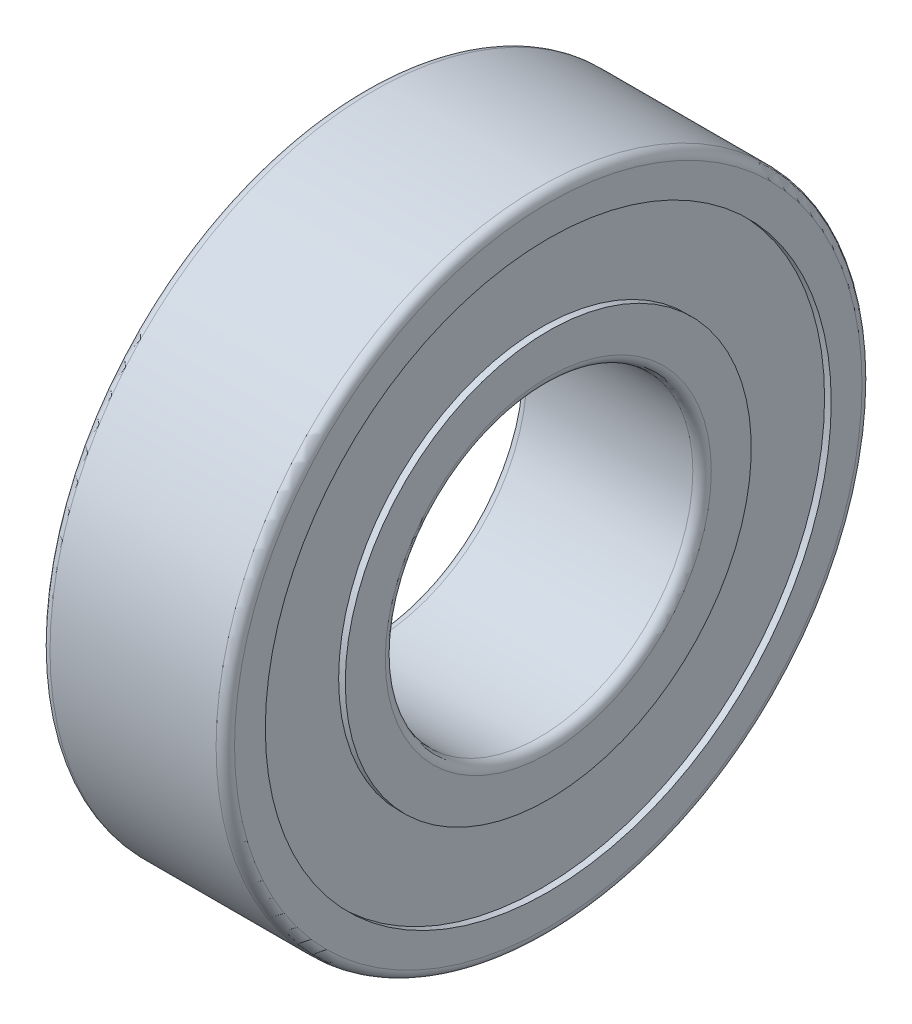
ISO-10303-21;
HEADER;
FILE_DESCRIPTION(('STEP AP214'),'2;1');
FILE_NAME('part.step','',(''),(''),'','','');
FILE_SCHEMA(('AUTOMOTIVE_DESIGN { 1 0 10303 214 1 1 1 1 }'));
ENDSEC;
DATA;
#1=APPLICATION_CONTEXT('core data for automotive mechanical design processes');
#2=APPLICATION_PROTOCOL_DEFINITION('international standard','automotive_design',2000,#1);
#3=PRODUCT_CONTEXT('',#1,'mechanical');
#4=PRODUCT('Part','Part','',(#3));
#5=PRODUCT_RELATED_PRODUCT_CATEGORY('part','',(#4));
#6=PRODUCT_DEFINITION_FORMATION('','',#4);
#7=PRODUCT_DEFINITION_CONTEXT('part definition',#1,'design');
#8=PRODUCT_DEFINITION('design','',#6,#7);
#9=PRODUCT_DEFINITION_SHAPE('','',#8);
#10=(LENGTH_UNIT() NAMED_UNIT(*) SI_UNIT(.MILLI.,.METRE.));
#11=(NAMED_UNIT(*) PLANE_ANGLE_UNIT() SI_UNIT($,.RADIAN.));
#12=(NAMED_UNIT(*) SI_UNIT($,.STERADIAN.) SOLID_ANGLE_UNIT());
#13=UNCERTAINTY_MEASURE_WITH_UNIT(LENGTH_MEASURE(1.E-05),#10,'distance_accuracy_value','');
#14=(GEOMETRIC_REPRESENTATION_CONTEXT(3) GLOBAL_UNCERTAINTY_ASSIGNED_CONTEXT((#13)) GLOBAL_UNIT_ASSIGNED_CONTEXT((#10,
#11,#12)) REPRESENTATION_CONTEXT('',''));
#15=CARTESIAN_POINT('',(0.,0.,0.));
#16=DIRECTION('',(0.,0.,1.));
#17=DIRECTION('',(1.,0.,0.));
#18=AXIS2_PLACEMENT_3D('',#15,#16,#17);
#19=CARTESIAN_POINT('',(12.,0.,0.));
#20=DIRECTION('',(-1.,0.,0.));
#21=DIRECTION('',(0.,0.,1.));
#22=AXIS2_PLACEMENT_3D('',#19,#20,#21);
#23=CYLINDRICAL_SURFACE('',#22,10.);
#24=CARTESIAN_POINT('',(0.600000000000005,0.,0.));
#25=DIRECTION('',(1.,0.,0.));
#26=DIRECTION('',(0.,0.,-1.));
#27=AXIS2_PLACEMENT_3D('',#24,#25,#26);
#28=CIRCLE('',#27,10.);
#29=CARTESIAN_POINT('',(0.600000000000005,0.,-10.));
#30=VERTEX_POINT('',#29);
#31=EDGE_CURVE('E272',#30,#30,#28,.T.);
#32=ORIENTED_EDGE('',*,*,#31,.F.);
#33=EDGE_LOOP('',(#32));
#34=FACE_BOUND('',#33,.T.);
#35=CARTESIAN_POINT('',(11.4,0.,0.));
#36=DIRECTION('',(1.,0.,0.));
#37=DIRECTION('',(0.,0.,-1.));
#38=AXIS2_PLACEMENT_3D('',#35,#36,#37);
#39=CIRCLE('',#38,9.99999999999999);
#40=CARTESIAN_POINT('',(11.4,0.,-9.99999999999999));
#41=VERTEX_POINT('',#40);
#42=EDGE_CURVE('E63',#41,#41,#39,.F.);
#43=ORIENTED_EDGE('',*,*,#42,.F.);
#44=EDGE_LOOP('',(#43));
#45=FACE_BOUND('',#44,.T.);
#46=ADVANCED_FACE('F17',(#34,#45),#23,.F.);
#47=CARTESIAN_POINT('',(0.600000000000004,0.,0.));
#48=DIRECTION('',(1.,0.,0.));
#49=DIRECTION('',(0.,0.,-1.));
#50=AXIS2_PLACEMENT_3D('',#47,#48,#49);
#51=TOROIDAL_SURFACE('',#50,10.6,0.600000000000004);
#52=CARTESIAN_POINT('',(0.,0.,0.));
#53=DIRECTION('',(-1.,0.,0.));
#54=DIRECTION('',(0.,0.,-1.));
#55=AXIS2_PLACEMENT_3D('',#52,#53,#54);
#56=CIRCLE('',#55,10.6);
#57=CARTESIAN_POINT('',(0.,0.,10.6));
#58=VERTEX_POINT('',#57);
#59=CARTESIAN_POINT('',(0.,0.,-10.6));
#60=VERTEX_POINT('',#59);
#61=EDGE_CURVE('E57',#58,#60,#56,.F.);
#62=ORIENTED_EDGE('',*,*,#61,.F.);
#63=CARTESIAN_POINT('',(0.,0.,0.));
#64=DIRECTION('',(-1.,0.,0.));
#65=DIRECTION('',(0.,0.,1.));
#66=AXIS2_PLACEMENT_3D('',#63,#64,#65);
#67=CIRCLE('',#66,10.6);
#68=EDGE_CURVE('E54',#60,#58,#67,.F.);
#69=ORIENTED_EDGE('',*,*,#68,.F.);
#70=EDGE_LOOP('',(#62,#69));
#71=FACE_BOUND('',#70,.T.);
#72=ORIENTED_EDGE('',*,*,#31,.T.);
#73=EDGE_LOOP('',(#72));
#74=FACE_BOUND('',#73,.T.);
#75=ADVANCED_FACE('F58',(#71,#74),#51,.T.);
#76=CARTESIAN_POINT('',(11.4,0.,0.));
#77=DIRECTION('',(1.,0.,0.));
#78=DIRECTION('',(0.,0.,-1.));
#79=AXIS2_PLACEMENT_3D('',#76,#77,#78);
#80=TOROIDAL_SURFACE('',#79,10.6,0.600000000000005);
#81=ORIENTED_EDGE('',*,*,#42,.T.);
#82=EDGE_LOOP('',(#81));
#83=FACE_BOUND('',#82,.T.);
#84=CARTESIAN_POINT('',(12.,0.,0.));
#85=DIRECTION('',(1.,0.,0.));
#86=DIRECTION('',(0.,0.,1.));
#87=AXIS2_PLACEMENT_3D('',#84,#85,#86);
#88=CIRCLE('',#87,10.6);
#89=CARTESIAN_POINT('',(12.,0.,-10.6));
#90=VERTEX_POINT('',#89);
#91=CARTESIAN_POINT('',(12.,0.,10.6));
#92=VERTEX_POINT('',#91);
#93=EDGE_CURVE('E226',#90,#92,#88,.F.);
#94=ORIENTED_EDGE('',*,*,#93,.F.);
#95=CARTESIAN_POINT('',(12.,0.,0.));
#96=DIRECTION('',(1.,0.,0.));
#97=DIRECTION('',(0.,0.,-1.));
#98=AXIS2_PLACEMENT_3D('',#95,#96,#97);
#99=CIRCLE('',#98,10.6);
#100=EDGE_CURVE('E69',#92,#90,#99,.F.);
#101=ORIENTED_EDGE('',*,*,#100,.F.);
#102=EDGE_LOOP('',(#94,#101));
#103=FACE_BOUND('',#102,.T.);
#104=ADVANCED_FACE('F90',(#83,#103),#80,.T.);
#105=CARTESIAN_POINT('',(0.,13.2,0.));
#106=DIRECTION('',(-1.,0.,0.));
#107=DIRECTION('',(0.,0.,1.));
#108=AXIS2_PLACEMENT_3D('',#105,#106,#107);
#109=PLANE('',#108);
#110=ORIENTED_EDGE('',*,*,#61,.T.);
#111=ORIENTED_EDGE('',*,*,#68,.T.);
#112=EDGE_LOOP('',(#110,#111));
#113=FACE_BOUND('',#112,.T.);
#114=CARTESIAN_POINT('',(0.,0.,0.));
#115=DIRECTION('',(-1.,0.,0.));
#116=DIRECTION('',(0.,0.,1.));
#117=AXIS2_PLACEMENT_3D('',#114,#115,#116);
#118=CIRCLE('',#117,13.2);
#119=CARTESIAN_POINT('',(0.,0.,13.2));
#120=VERTEX_POINT('',#119);
#121=EDGE_CURVE('E236',#120,#120,#118,.F.);
#122=ORIENTED_EDGE('',*,*,#121,.F.);
#123=EDGE_LOOP('',(#122));
#124=FACE_BOUND('',#123,.T.);
#125=ADVANCED_FACE('F66',(#113,#124),#109,.T.);
#126=CARTESIAN_POINT('',(12.,10.6,0.));
#127=DIRECTION('',(1.,0.,0.));
#128=DIRECTION('',(0.,0.,-1.));
#129=AXIS2_PLACEMENT_3D('',#126,#127,#128);
#130=PLANE('',#129);
#131=ORIENTED_EDGE('',*,*,#100,.T.);
#132=ORIENTED_EDGE('',*,*,#93,.T.);
#133=EDGE_LOOP('',(#131,#132));
#134=FACE_BOUND('',#133,.T.);
#135=CARTESIAN_POINT('',(12.,0.,0.));
#136=DIRECTION('',(-1.,0.,0.));
#137=DIRECTION('',(0.,0.,1.));
#138=AXIS2_PLACEMENT_3D('',#135,#136,#137);
#139=CIRCLE('',#138,13.2);
#140=CARTESIAN_POINT('',(12.,0.,13.2));
#141=VERTEX_POINT('',#140);
#142=EDGE_CURVE('E242',#141,#141,#139,.T.);
#143=ORIENTED_EDGE('',*,*,#142,.F.);
#144=EDGE_LOOP('',(#143));
#145=FACE_BOUND('',#144,.T.);
#146=ADVANCED_FACE('F89',(#134,#145),#130,.T.);
#147=CARTESIAN_POINT('',(12.,0.,0.));
#148=DIRECTION('',(-1.,0.,0.));
#149=DIRECTION('',(0.,0.,1.));
#150=AXIS2_PLACEMENT_3D('',#147,#148,#149);
#151=CYLINDRICAL_SURFACE('',#150,13.2);
#152=ORIENTED_EDGE('',*,*,#121,.T.);
#153=EDGE_LOOP('',(#152));
#154=FACE_BOUND('',#153,.T.);
#155=CARTESIAN_POINT('',(0.432999999999996,0.,0.));
#156=DIRECTION('',(-1.,0.,0.));
#157=DIRECTION('',(0.,0.,1.));
#158=AXIS2_PLACEMENT_3D('',#155,#156,#157);
#159=CIRCLE('',#158,13.2);
#160=CARTESIAN_POINT('',(0.432999999999996,0.,13.2));
#161=VERTEX_POINT('',#160);
#162=EDGE_CURVE('E257',#161,#161,#159,.F.);
#163=ORIENTED_EDGE('',*,*,#162,.F.);
#164=EDGE_LOOP('',(#163));
#165=FACE_BOUND('',#164,.T.);
#166=ADVANCED_FACE('F294',(#154,#165),#151,.T.);
#167=CARTESIAN_POINT('',(12.,0.,0.));
#168=DIRECTION('',(-1.,0.,0.));
#169=DIRECTION('',(0.,0.,1.));
#170=AXIS2_PLACEMENT_3D('',#167,#168,#169);
#171=CYLINDRICAL_SURFACE('',#170,13.2);
#172=CARTESIAN_POINT('',(11.567,0.,0.));
#173=DIRECTION('',(-1.,0.,0.));
#174=DIRECTION('',(0.,0.,1.));
#175=AXIS2_PLACEMENT_3D('',#172,#173,#174);
#176=CIRCLE('',#175,13.2);
#177=CARTESIAN_POINT('',(11.567,0.,13.2));
#178=VERTEX_POINT('',#177);
#179=EDGE_CURVE('E253',#178,#178,#176,.T.);
#180=ORIENTED_EDGE('',*,*,#179,.F.);
#181=EDGE_LOOP('',(#180));
#182=FACE_BOUND('',#181,.T.);
#183=ORIENTED_EDGE('',*,*,#142,.T.);
#184=EDGE_LOOP('',(#183));
#185=FACE_BOUND('',#184,.T.);
#186=ADVANCED_FACE('F292',(#182,#185),#171,.T.);
#187=CARTESIAN_POINT('',(0.433,18.4,0.));
#188=DIRECTION('',(-1.,0.,0.));
#189=DIRECTION('',(0.,0.,1.));
#190=AXIS2_PLACEMENT_3D('',#187,#188,#189);
#191=PLANE('',#190);
#192=ORIENTED_EDGE('',*,*,#162,.T.);
#193=EDGE_LOOP('',(#192));
#194=FACE_BOUND('',#193,.T.);
#195=CARTESIAN_POINT('',(0.432999999999996,0.,0.));
#196=DIRECTION('',(-1.,0.,0.));
#197=DIRECTION('',(0.,0.,1.));
#198=AXIS2_PLACEMENT_3D('',#195,#196,#197);
#199=CIRCLE('',#198,18.4);
#200=CARTESIAN_POINT('',(0.432999999999996,0.,18.4));
#201=VERTEX_POINT('',#200);
#202=EDGE_CURVE('E256',#201,#201,#199,.T.);
#203=ORIENTED_EDGE('',*,*,#202,.T.);
#204=EDGE_LOOP('',(#203));
#205=FACE_BOUND('',#204,.T.);
#206=ADVANCED_FACE('F340',(#194,#205),#191,.T.);
#207=CARTESIAN_POINT('',(11.567,13.2,0.));
#208=DIRECTION('',(1.,0.,0.));
#209=DIRECTION('',(0.,0.,-1.));
#210=AXIS2_PLACEMENT_3D('',#207,#208,#209);
#211=PLANE('',#210);
#212=ORIENTED_EDGE('',*,*,#179,.T.);
#213=EDGE_LOOP('',(#212));
#214=FACE_BOUND('',#213,.T.);
#215=CARTESIAN_POINT('',(11.567,0.,0.));
#216=DIRECTION('',(-1.,0.,0.));
#217=DIRECTION('',(0.,0.,1.));
#218=AXIS2_PLACEMENT_3D('',#215,#216,#217);
#219=CIRCLE('',#218,18.4);
#220=CARTESIAN_POINT('',(11.567,0.,18.4));
#221=VERTEX_POINT('',#220);
#222=EDGE_CURVE('E250',#221,#221,#219,.F.);
#223=ORIENTED_EDGE('',*,*,#222,.T.);
#224=EDGE_LOOP('',(#223));
#225=FACE_BOUND('',#224,.T.);
#226=ADVANCED_FACE('F334',(#214,#225),#211,.T.);
#227=CARTESIAN_POINT('',(12.,0.,0.));
#228=DIRECTION('',(-1.,0.,0.));
#229=DIRECTION('',(0.,0.,1.));
#230=AXIS2_PLACEMENT_3D('',#227,#228,#229);
#231=CYLINDRICAL_SURFACE('',#230,18.4);
#232=CARTESIAN_POINT('',(0.,0.,0.));
#233=DIRECTION('',(-1.,0.,0.));
#234=DIRECTION('',(0.,0.,1.));
#235=AXIS2_PLACEMENT_3D('',#232,#233,#234);
#236=CIRCLE('',#235,18.4);
#237=CARTESIAN_POINT('',(0.,0.,18.4));
#238=VERTEX_POINT('',#237);
#239=EDGE_CURVE('E247',#238,#238,#236,.F.);
#240=ORIENTED_EDGE('',*,*,#239,.F.);
#241=EDGE_LOOP('',(#240));
#242=FACE_BOUND('',#241,.T.);
#243=ORIENTED_EDGE('',*,*,#202,.F.);
#244=EDGE_LOOP('',(#243));
#245=FACE_BOUND('',#244,.T.);
#246=ADVANCED_FACE('F328',(#242,#245),#231,.F.);
#247=CARTESIAN_POINT('',(12.,0.,0.));
#248=DIRECTION('',(-1.,0.,0.));
#249=DIRECTION('',(0.,0.,1.));
#250=AXIS2_PLACEMENT_3D('',#247,#248,#249);
#251=CYLINDRICAL_SURFACE('',#250,18.4);
#252=ORIENTED_EDGE('',*,*,#222,.F.);
#253=EDGE_LOOP('',(#252));
#254=FACE_BOUND('',#253,.T.);
#255=CARTESIAN_POINT('',(12.,0.,0.));
#256=DIRECTION('',(-1.,0.,0.));
#257=DIRECTION('',(0.,0.,1.));
#258=AXIS2_PLACEMENT_3D('',#255,#256,#257);
#259=CIRCLE('',#258,18.4);
#260=CARTESIAN_POINT('',(12.,0.,18.4));
#261=VERTEX_POINT('',#260);
#262=EDGE_CURVE('E249',#261,#261,#259,.T.);
#263=ORIENTED_EDGE('',*,*,#262,.F.);
#264=EDGE_LOOP('',(#263));
#265=FACE_BOUND('',#264,.T.);
#266=ADVANCED_FACE('F192',(#254,#265),#251,.F.);
#267=CARTESIAN_POINT('',(0.,20.4,0.));
#268=DIRECTION('',(-1.,0.,0.));
#269=DIRECTION('',(0.,0.,1.));
#270=AXIS2_PLACEMENT_3D('',#267,#268,#269);
#271=PLANE('',#270);
#272=ORIENTED_EDGE('',*,*,#239,.T.);
#273=EDGE_LOOP('',(#272));
#274=FACE_BOUND('',#273,.T.);
#275=CARTESIAN_POINT('',(0.,0.,0.));
#276=DIRECTION('',(1.,0.,0.));
#277=DIRECTION('',(0.,0.,1.));
#278=AXIS2_PLACEMENT_3D('',#275,#276,#277);
#279=CIRCLE('',#278,20.4);
#280=CARTESIAN_POINT('',(0.,0.,20.4));
#281=VERTEX_POINT('',#280);
#282=CARTESIAN_POINT('',(0.,0.,-20.4));
#283=VERTEX_POINT('',#282);
#284=EDGE_CURVE('E178',#281,#283,#279,.T.);
#285=ORIENTED_EDGE('',*,*,#284,.F.);
#286=CARTESIAN_POINT('',(0.,0.,0.));
#287=DIRECTION('',(1.,0.,0.));
#288=DIRECTION('',(0.,0.,-1.));
#289=AXIS2_PLACEMENT_3D('',#286,#287,#288);
#290=CIRCLE('',#289,20.4);
#291=EDGE_CURVE('E259',#283,#281,#290,.T.);
#292=ORIENTED_EDGE('',*,*,#291,.F.);
#293=EDGE_LOOP('',(#285,#292));
#294=FACE_BOUND('',#293,.T.);
#295=ADVANCED_FACE('F183',(#274,#294),#271,.T.);
#296=CARTESIAN_POINT('',(12.,18.4,0.));
#297=DIRECTION('',(1.,0.,0.));
#298=DIRECTION('',(0.,0.,-1.));
#299=AXIS2_PLACEMENT_3D('',#296,#297,#298);
#300=PLANE('',#299);
#301=ORIENTED_EDGE('',*,*,#262,.T.);
#302=EDGE_LOOP('',(#301));
#303=FACE_BOUND('',#302,.T.);
#304=CARTESIAN_POINT('',(12.,0.,0.));
#305=DIRECTION('',(-1.,0.,0.));
#306=DIRECTION('',(0.,0.,1.));
#307=AXIS2_PLACEMENT_3D('',#304,#305,#306);
#308=CIRCLE('',#307,20.4);
#309=CARTESIAN_POINT('',(12.,0.,20.4));
#310=VERTEX_POINT('',#309);
#311=CARTESIAN_POINT('',(12.,0.,-20.4));
#312=VERTEX_POINT('',#311);
#313=EDGE_CURVE('E36',#310,#312,#308,.T.);
#314=ORIENTED_EDGE('',*,*,#313,.F.);
#315=CARTESIAN_POINT('',(12.,0.,0.));
#316=DIRECTION('',(-1.,0.,0.));
#317=DIRECTION('',(0.,0.,-1.));
#318=AXIS2_PLACEMENT_3D('',#315,#316,#317);
#319=CIRCLE('',#318,20.4);
#320=EDGE_CURVE('E154',#312,#310,#319,.T.);
#321=ORIENTED_EDGE('',*,*,#320,.F.);
#322=EDGE_LOOP('',(#314,#321));
#323=FACE_BOUND('',#322,.T.);
#324=ADVANCED_FACE('F133',(#303,#323),#300,.T.);
#325=CARTESIAN_POINT('',(0.600000000000004,0.,0.));
#326=DIRECTION('',(1.,0.,0.));
#327=DIRECTION('',(0.,0.,-1.));
#328=AXIS2_PLACEMENT_3D('',#325,#326,#327);
#329=TOROIDAL_SURFACE('',#328,20.4,0.600000000000007);
#330=ORIENTED_EDGE('',*,*,#291,.T.);
#331=ORIENTED_EDGE('',*,*,#284,.T.);
#332=EDGE_LOOP('',(#330,#331));
#333=FACE_BOUND('',#332,.T.);
#334=CARTESIAN_POINT('',(0.600000000000003,0.,0.));
#335=DIRECTION('',(-1.,0.,0.));
#336=DIRECTION('',(0.,0.,1.));
#337=AXIS2_PLACEMENT_3D('',#334,#335,#336);
#338=CIRCLE('',#337,21.);
#339=CARTESIAN_POINT('',(0.600000000000003,0.,21.));
#340=VERTEX_POINT('',#339);
#341=EDGE_CURVE('E28',#340,#340,#338,.F.);
#342=ORIENTED_EDGE('',*,*,#341,.F.);
#343=EDGE_LOOP('',(#342));
#344=FACE_BOUND('',#343,.T.);
#345=ADVANCED_FACE('F121',(#333,#344),#329,.T.);
#346=CARTESIAN_POINT('',(11.4,0.,0.));
#347=DIRECTION('',(1.,0.,0.));
#348=DIRECTION('',(0.,0.,-1.));
#349=AXIS2_PLACEMENT_3D('',#346,#347,#348);
#350=TOROIDAL_SURFACE('',#349,20.4,0.600000000000007);
#351=ORIENTED_EDGE('',*,*,#313,.T.);
#352=ORIENTED_EDGE('',*,*,#320,.T.);
#353=EDGE_LOOP('',(#351,#352));
#354=FACE_BOUND('',#353,.T.);
#355=CARTESIAN_POINT('',(11.4,0.,0.));
#356=DIRECTION('',(-1.,0.,0.));
#357=DIRECTION('',(0.,0.,1.));
#358=AXIS2_PLACEMENT_3D('',#355,#356,#357);
#359=CIRCLE('',#358,21.);
#360=CARTESIAN_POINT('',(11.4,0.,21.));
#361=VERTEX_POINT('',#360);
#362=EDGE_CURVE('E11',#361,#361,#359,.T.);
#363=ORIENTED_EDGE('',*,*,#362,.F.);
#364=EDGE_LOOP('',(#363));
#365=FACE_BOUND('',#364,.T.);
#366=ADVANCED_FACE('F132',(#354,#365),#350,.T.);
#367=CARTESIAN_POINT('',(12.,0.,0.));
#368=DIRECTION('',(-1.,0.,0.));
#369=DIRECTION('',(0.,0.,1.));
#370=AXIS2_PLACEMENT_3D('',#367,#368,#369);
#371=CYLINDRICAL_SURFACE('',#370,21.);
#372=ORIENTED_EDGE('',*,*,#362,.T.);
#373=EDGE_LOOP('',(#372));
#374=FACE_BOUND('',#373,.T.);
#375=ORIENTED_EDGE('',*,*,#341,.T.);
#376=EDGE_LOOP('',(#375));
#377=FACE_BOUND('',#376,.T.);
#378=ADVANCED_FACE('F299',(#374,#377),#371,.T.);
#379=CLOSED_SHELL('',(#46,#75,#104,#125,#146,#166,#186,#206,#226,#246,#266,#295,#324,#345,#366,#378));
#380=MANIFOLD_SOLID_BREP('B1',#379);
#381=ADVANCED_BREP_SHAPE_REPRESENTATION('',(#18,#380),#14);
#382=SHAPE_DEFINITION_REPRESENTATION(#9,#381);
ENDSEC;
END-ISO-10303-21;
